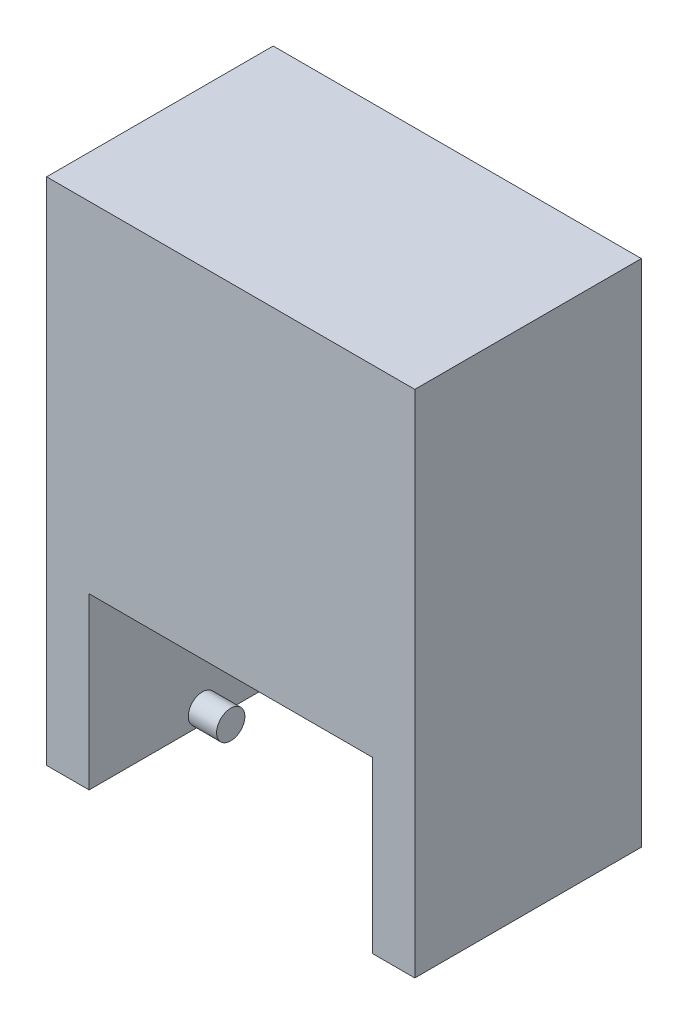
ISO-10303-21;
HEADER;
FILE_DESCRIPTION(('STEP AP214'),'2;1');
FILE_NAME('part.step','',(''),(''),'','','');
FILE_SCHEMA(('AUTOMOTIVE_DESIGN { 1 0 10303 214 1 1 1 1 }'));
ENDSEC;
DATA;
#1=APPLICATION_CONTEXT('core data for automotive mechanical design processes');
#2=APPLICATION_PROTOCOL_DEFINITION('international standard','automotive_design',2000,#1);
#3=PRODUCT_CONTEXT('',#1,'mechanical');
#4=PRODUCT('Part','Part','',(#3));
#5=PRODUCT_RELATED_PRODUCT_CATEGORY('part','',(#4));
#6=PRODUCT_DEFINITION_FORMATION('','',#4);
#7=PRODUCT_DEFINITION_CONTEXT('part definition',#1,'design');
#8=PRODUCT_DEFINITION('design','',#6,#7);
#9=PRODUCT_DEFINITION_SHAPE('','',#8);
#10=(LENGTH_UNIT() NAMED_UNIT(*) SI_UNIT(.MILLI.,.METRE.));
#11=(NAMED_UNIT(*) PLANE_ANGLE_UNIT() SI_UNIT($,.RADIAN.));
#12=(NAMED_UNIT(*) SI_UNIT($,.STERADIAN.) SOLID_ANGLE_UNIT());
#13=UNCERTAINTY_MEASURE_WITH_UNIT(LENGTH_MEASURE(1.E-05),#10,'distance_accuracy_value','');
#14=(GEOMETRIC_REPRESENTATION_CONTEXT(3) GLOBAL_UNCERTAINTY_ASSIGNED_CONTEXT((#13)) GLOBAL_UNIT_ASSIGNED_CONTEXT((#10,
#11,#12)) REPRESENTATION_CONTEXT('',''));
#15=CARTESIAN_POINT('',(0.,0.,0.));
#16=DIRECTION('',(0.,0.,1.));
#17=DIRECTION('',(1.,0.,0.));
#18=AXIS2_PLACEMENT_3D('',#15,#16,#17);
#19=CARTESIAN_POINT('',(0.,0.,203.2));
#20=DIRECTION('',(0.,1.,0.));
#21=DIRECTION('',(0.,0.,1.));
#22=AXIS2_PLACEMENT_3D('',#19,#20,#21);
#23=PLANE('',#22);
#24=DIRECTION('',(0.,0.,-1.));
#25=VECTOR('',#24,1.);
#26=CARTESIAN_POINT('',(38.0999999999999,0.,318.516));
#27=LINE('',#26,#25);
#28=CARTESIAN_POINT('',(38.0999999999999,0.,203.2));
#29=VERTEX_POINT('',#28);
#30=CARTESIAN_POINT('',(38.1000000000001,0.,101.6));
#31=VERTEX_POINT('',#30);
#32=EDGE_CURVE('E104',#29,#31,#27,.T.);
#33=ORIENTED_EDGE('',*,*,#32,.F.);
#34=DIRECTION('',(1.,0.,0.));
#35=VECTOR('',#34,1.);
#36=CARTESIAN_POINT('',(0.,0.,203.2));
#37=LINE('',#36,#35);
#38=CARTESIAN_POINT('',(0.,0.,203.2));
#39=VERTEX_POINT('',#38);
#40=EDGE_CURVE('E135',#39,#29,#37,.T.);
#41=ORIENTED_EDGE('',*,*,#40,.F.);
#42=DIRECTION('',(0.,0.,-1.));
#43=VECTOR('',#42,1.);
#44=CARTESIAN_POINT('',(0.,0.,203.2));
#45=LINE('',#44,#43);
#46=CARTESIAN_POINT('',(0.,0.,0.));
#47=VERTEX_POINT('',#46);
#48=EDGE_CURVE('E157',#39,#47,#45,.T.);
#49=ORIENTED_EDGE('',*,*,#48,.T.);
#50=DIRECTION('',(1.,0.,0.));
#51=VECTOR('',#50,1.);
#52=CARTESIAN_POINT('',(0.,0.,0.));
#53=LINE('',#52,#51);
#54=CARTESIAN_POINT('',(38.0999999999999,0.,1.11022302462516E-13));
#55=VERTEX_POINT('',#54);
#56=EDGE_CURVE('E118',#47,#55,#53,.T.);
#57=ORIENTED_EDGE('',*,*,#56,.T.);
#58=EDGE_CURVE('E114',#31,#55,#27,.T.);
#59=ORIENTED_EDGE('',*,*,#58,.F.);
#60=EDGE_LOOP('',(#33,#41,#49,#57,#59));
#61=FACE_BOUND('',#60,.T.);
#62=ADVANCED_FACE('F34',(#61),#23,.F.);
#63=DIRECTION('',(0.,0.,-1.));
#64=VECTOR('',#63,1.);
#65=CARTESIAN_POINT('',(292.1,0.,318.516));
#66=LINE('',#65,#64);
#67=CARTESIAN_POINT('',(292.1,0.,203.2));
#68=VERTEX_POINT('',#67);
#69=CARTESIAN_POINT('',(292.1,0.,101.6));
#70=VERTEX_POINT('',#69);
#71=EDGE_CURVE('E119',#68,#70,#66,.T.);
#72=ORIENTED_EDGE('',*,*,#71,.T.);
#73=CARTESIAN_POINT('',(292.1,0.,1.11022302462516E-13));
#74=VERTEX_POINT('',#73);
#75=EDGE_CURVE('E121',#70,#74,#66,.T.);
#76=ORIENTED_EDGE('',*,*,#75,.T.);
#77=CARTESIAN_POINT('',(330.2,0.,0.));
#78=VERTEX_POINT('',#77);
#79=EDGE_CURVE('E144',#74,#78,#53,.T.);
#80=ORIENTED_EDGE('',*,*,#79,.T.);
#81=DIRECTION('',(0.,0.,-1.));
#82=VECTOR('',#81,1.);
#83=CARTESIAN_POINT('',(330.2,0.,203.2));
#84=LINE('',#83,#82);
#85=CARTESIAN_POINT('',(330.2,0.,203.2));
#86=VERTEX_POINT('',#85);
#87=EDGE_CURVE('E154',#86,#78,#84,.T.);
#88=ORIENTED_EDGE('',*,*,#87,.F.);
#89=EDGE_CURVE('E133',#68,#86,#37,.T.);
#90=ORIENTED_EDGE('',*,*,#89,.F.);
#91=EDGE_LOOP('',(#72,#76,#80,#88,#90));
#92=FACE_BOUND('',#91,.T.);
#93=ADVANCED_FACE('F198',(#92),#23,.F.);
#94=CARTESIAN_POINT('',(0.,0.,203.2));
#95=DIRECTION('',(0.,0.,-1.));
#96=DIRECTION('',(-1.,0.,0.));
#97=AXIS2_PLACEMENT_3D('',#94,#95,#96);
#98=PLANE('',#97);
#99=DIRECTION('',(0.,-1.,0.));
#100=VECTOR('',#99,1.);
#101=CARTESIAN_POINT('',(38.0999999999999,0.,203.2));
#102=LINE('',#101,#100);
#103=CARTESIAN_POINT('',(38.0999999999999,152.4,203.2));
#104=VERTEX_POINT('',#103);
#105=EDGE_CURVE('E110',#104,#29,#102,.T.);
#106=ORIENTED_EDGE('',*,*,#105,.F.);
#107=DIRECTION('',(-1.,0.,0.));
#108=VECTOR('',#107,1.);
#109=CARTESIAN_POINT('',(0.,152.4,203.2));
#110=LINE('',#109,#108);
#111=CARTESIAN_POINT('',(292.1,152.4,203.2));
#112=VERTEX_POINT('',#111);
#113=EDGE_CURVE('E113',#112,#104,#110,.T.);
#114=ORIENTED_EDGE('',*,*,#113,.F.);
#115=DIRECTION('',(0.,1.,0.));
#116=VECTOR('',#115,1.);
#117=CARTESIAN_POINT('',(292.1,1.06396373193244E-13,203.2));
#118=LINE('',#117,#116);
#119=EDGE_CURVE('E126',#68,#112,#118,.T.);
#120=ORIENTED_EDGE('',*,*,#119,.F.);
#121=ORIENTED_EDGE('',*,*,#89,.T.);
#122=DIRECTION('',(0.,1.,0.));
#123=VECTOR('',#122,1.);
#124=CARTESIAN_POINT('',(330.2,0.,203.2));
#125=LINE('',#124,#123);
#126=CARTESIAN_POINT('',(330.2,457.2,203.2));
#127=VERTEX_POINT('',#126);
#128=EDGE_CURVE('E137',#86,#127,#125,.T.);
#129=ORIENTED_EDGE('',*,*,#128,.T.);
#130=DIRECTION('',(-1.,0.,0.));
#131=VECTOR('',#130,1.);
#132=CARTESIAN_POINT('',(-1.11022302462516E-13,457.2,203.2));
#133=LINE('',#132,#131);
#134=CARTESIAN_POINT('',(-1.11022302462516E-13,457.2,203.2));
#135=VERTEX_POINT('',#134);
#136=EDGE_CURVE('E139',#127,#135,#133,.T.);
#137=ORIENTED_EDGE('',*,*,#136,.T.);
#138=DIRECTION('',(0.,-1.,0.));
#139=VECTOR('',#138,1.);
#140=CARTESIAN_POINT('',(0.,0.,203.2));
#141=LINE('',#140,#139);
#142=EDGE_CURVE('E130',#135,#39,#141,.T.);
#143=ORIENTED_EDGE('',*,*,#142,.T.);
#144=ORIENTED_EDGE('',*,*,#40,.T.);
#145=EDGE_LOOP('',(#106,#114,#120,#121,#129,#137,#143,#144));
#146=FACE_BOUND('',#145,.T.);
#147=ADVANCED_FACE('F202',(#146),#98,.F.);
#148=CARTESIAN_POINT('',(0.,0.,0.));
#149=DIRECTION('',(0.,0.,-1.));
#150=DIRECTION('',(-1.,0.,0.));
#151=AXIS2_PLACEMENT_3D('',#148,#149,#150);
#152=PLANE('',#151);
#153=DIRECTION('',(-1.,0.,0.));
#154=VECTOR('',#153,1.);
#155=CARTESIAN_POINT('',(0.,152.4,0.));
#156=LINE('',#155,#154);
#157=CARTESIAN_POINT('',(292.1,152.4,1.11022302462516E-13));
#158=VERTEX_POINT('',#157);
#159=CARTESIAN_POINT('',(38.0999999999999,152.4,0.));
#160=VERTEX_POINT('',#159);
#161=EDGE_CURVE('E159',#158,#160,#156,.T.);
#162=ORIENTED_EDGE('',*,*,#161,.T.);
#163=DIRECTION('',(0.,-1.,0.));
#164=VECTOR('',#163,1.);
#165=CARTESIAN_POINT('',(38.0999999999999,0.,0.));
#166=LINE('',#165,#164);
#167=EDGE_CURVE('E11',#160,#55,#166,.T.);
#168=ORIENTED_EDGE('',*,*,#167,.T.);
#169=ORIENTED_EDGE('',*,*,#56,.F.);
#170=DIRECTION('',(0.,-1.,0.));
#171=VECTOR('',#170,1.);
#172=CARTESIAN_POINT('',(0.,0.,0.));
#173=LINE('',#172,#171);
#174=CARTESIAN_POINT('',(-1.11022302462516E-13,457.2,0.));
#175=VERTEX_POINT('',#174);
#176=EDGE_CURVE('E129',#175,#47,#173,.T.);
#177=ORIENTED_EDGE('',*,*,#176,.F.);
#178=DIRECTION('',(-1.,0.,0.));
#179=VECTOR('',#178,1.);
#180=CARTESIAN_POINT('',(-1.11022302462516E-13,457.2,0.));
#181=LINE('',#180,#179);
#182=CARTESIAN_POINT('',(330.2,457.2,0.));
#183=VERTEX_POINT('',#182);
#184=EDGE_CURVE('E134',#183,#175,#181,.T.);
#185=ORIENTED_EDGE('',*,*,#184,.F.);
#186=DIRECTION('',(0.,1.,0.));
#187=VECTOR('',#186,1.);
#188=CARTESIAN_POINT('',(330.2,0.,0.));
#189=LINE('',#188,#187);
#190=EDGE_CURVE('E146',#78,#183,#189,.T.);
#191=ORIENTED_EDGE('',*,*,#190,.F.);
#192=ORIENTED_EDGE('',*,*,#79,.F.);
#193=DIRECTION('',(0.,1.,0.));
#194=VECTOR('',#193,1.);
#195=CARTESIAN_POINT('',(292.1,1.06396373193244E-13,0.));
#196=LINE('',#195,#194);
#197=EDGE_CURVE('E42',#74,#158,#196,.T.);
#198=ORIENTED_EDGE('',*,*,#197,.T.);
#199=EDGE_LOOP('',(#162,#168,#169,#177,#185,#191,#192,#198));
#200=FACE_BOUND('',#199,.T.);
#201=ADVANCED_FACE('F165',(#200),#152,.T.);
#202=CARTESIAN_POINT('',(0.,0.,203.2));
#203=DIRECTION('',(1.,0.,0.));
#204=DIRECTION('',(0.,1.,0.));
#205=AXIS2_PLACEMENT_3D('',#202,#203,#204);
#206=PLANE('',#205);
#207=ORIENTED_EDGE('',*,*,#176,.T.);
#208=ORIENTED_EDGE('',*,*,#48,.F.);
#209=ORIENTED_EDGE('',*,*,#142,.F.);
#210=DIRECTION('',(0.,0.,-1.));
#211=VECTOR('',#210,1.);
#212=CARTESIAN_POINT('',(-1.11022302462516E-13,457.2,203.2));
#213=LINE('',#212,#211);
#214=EDGE_CURVE('E141',#135,#175,#213,.T.);
#215=ORIENTED_EDGE('',*,*,#214,.T.);
#216=EDGE_LOOP('',(#207,#208,#209,#215));
#217=FACE_BOUND('',#216,.T.);
#218=ADVANCED_FACE('F36',(#217),#206,.F.);
#219=CARTESIAN_POINT('',(330.2,0.,203.2));
#220=DIRECTION('',(-1.,0.,0.));
#221=DIRECTION('',(0.,-1.,0.));
#222=AXIS2_PLACEMENT_3D('',#219,#220,#221);
#223=PLANE('',#222);
#224=ORIENTED_EDGE('',*,*,#190,.T.);
#225=DIRECTION('',(0.,0.,-1.));
#226=VECTOR('',#225,1.);
#227=CARTESIAN_POINT('',(330.2,457.2,203.2));
#228=LINE('',#227,#226);
#229=EDGE_CURVE('E151',#127,#183,#228,.T.);
#230=ORIENTED_EDGE('',*,*,#229,.F.);
#231=ORIENTED_EDGE('',*,*,#128,.F.);
#232=ORIENTED_EDGE('',*,*,#87,.T.);
#233=EDGE_LOOP('',(#224,#230,#231,#232));
#234=FACE_BOUND('',#233,.T.);
#235=ADVANCED_FACE('F205',(#234),#223,.F.);
#236=CARTESIAN_POINT('',(-1.11022302462516E-13,457.2,203.2));
#237=DIRECTION('',(0.,-1.,0.));
#238=DIRECTION('',(0.,0.,-1.));
#239=AXIS2_PLACEMENT_3D('',#236,#237,#238);
#240=PLANE('',#239);
#241=ORIENTED_EDGE('',*,*,#184,.T.);
#242=ORIENTED_EDGE('',*,*,#214,.F.);
#243=ORIENTED_EDGE('',*,*,#136,.F.);
#244=ORIENTED_EDGE('',*,*,#229,.T.);
#245=EDGE_LOOP('',(#241,#242,#243,#244));
#246=FACE_BOUND('',#245,.T.);
#247=ADVANCED_FACE('F208',(#246),#240,.F.);
#248=CARTESIAN_POINT('',(38.0999999999999,0.,318.516));
#249=DIRECTION('',(1.,0.,0.));
#250=DIRECTION('',(0.,0.,-1.));
#251=AXIS2_PLACEMENT_3D('',#248,#249,#250);
#252=PLANE('',#251);
#253=ORIENTED_EDGE('',*,*,#32,.T.);
#254=CARTESIAN_POINT('',(38.1000000000001,12.7,101.6));
#255=DIRECTION('',(-1.,0.,0.));
#256=DIRECTION('',(0.,-1.,0.));
#257=AXIS2_PLACEMENT_3D('',#254,#255,#256);
#258=CIRCLE('',#257,12.7);
#259=EDGE_CURVE('E108',#31,#31,#258,.T.);
#260=ORIENTED_EDGE('',*,*,#259,.T.);
#261=ORIENTED_EDGE('',*,*,#58,.T.);
#262=ORIENTED_EDGE('',*,*,#167,.F.);
#263=DIRECTION('',(0.,0.,-1.));
#264=VECTOR('',#263,1.);
#265=CARTESIAN_POINT('',(38.0999999999999,152.4,318.516));
#266=LINE('',#265,#264);
#267=EDGE_CURVE('E54',#104,#160,#266,.T.);
#268=ORIENTED_EDGE('',*,*,#267,.F.);
#269=ORIENTED_EDGE('',*,*,#105,.T.);
#270=EDGE_LOOP('',(#253,#260,#261,#262,#268,#269));
#271=FACE_BOUND('',#270,.T.);
#272=ADVANCED_FACE('F106',(#271),#252,.T.);
#273=CARTESIAN_POINT('',(292.1,0.,318.516));
#274=DIRECTION('',(-1.,0.,0.));
#275=DIRECTION('',(0.,-1.,0.));
#276=AXIS2_PLACEMENT_3D('',#273,#274,#275);
#277=PLANE('',#276);
#278=ORIENTED_EDGE('',*,*,#75,.F.);
#279=CARTESIAN_POINT('',(292.1,12.7000000000001,101.6));
#280=DIRECTION('',(-1.,0.,0.));
#281=DIRECTION('',(0.,-1.,0.));
#282=AXIS2_PLACEMENT_3D('',#279,#280,#281);
#283=CIRCLE('',#282,12.7);
#284=EDGE_CURVE('E47',#70,#70,#283,.T.);
#285=ORIENTED_EDGE('',*,*,#284,.F.);
#286=ORIENTED_EDGE('',*,*,#71,.F.);
#287=ORIENTED_EDGE('',*,*,#119,.T.);
#288=DIRECTION('',(0.,0.,-1.));
#289=VECTOR('',#288,1.);
#290=CARTESIAN_POINT('',(292.1,152.4,318.516));
#291=LINE('',#290,#289);
#292=EDGE_CURVE('E172',#112,#158,#291,.T.);
#293=ORIENTED_EDGE('',*,*,#292,.T.);
#294=ORIENTED_EDGE('',*,*,#197,.F.);
#295=EDGE_LOOP('',(#278,#285,#286,#287,#293,#294));
#296=FACE_BOUND('',#295,.T.);
#297=ADVANCED_FACE('F170',(#296),#277,.T.);
#298=CARTESIAN_POINT('',(38.0999999999999,152.4,318.516));
#299=DIRECTION('',(0.,-1.,0.));
#300=DIRECTION('',(1.,0.,0.));
#301=AXIS2_PLACEMENT_3D('',#298,#299,#300);
#302=PLANE('',#301);
#303=ORIENTED_EDGE('',*,*,#113,.T.);
#304=ORIENTED_EDGE('',*,*,#267,.T.);
#305=ORIENTED_EDGE('',*,*,#161,.F.);
#306=ORIENTED_EDGE('',*,*,#292,.F.);
#307=EDGE_LOOP('',(#303,#304,#305,#306));
#308=FACE_BOUND('',#307,.T.);
#309=ADVANCED_FACE('F222',(#308),#302,.T.);
#310=CARTESIAN_POINT('',(266.7,12.7000000000001,101.6));
#311=DIRECTION('',(1.,0.,0.));
#312=DIRECTION('',(0.,1.,0.));
#313=AXIS2_PLACEMENT_3D('',#310,#311,#312);
#314=CYLINDRICAL_SURFACE('',#313,12.7);
#315=CARTESIAN_POINT('',(266.7,12.7000000000001,101.6));
#316=DIRECTION('',(-1.,0.,0.));
#317=DIRECTION('',(0.,-1.,0.));
#318=AXIS2_PLACEMENT_3D('',#315,#316,#317);
#319=CIRCLE('',#318,12.7);
#320=CARTESIAN_POINT('',(266.7,0.,101.6));
#321=VERTEX_POINT('',#320);
#322=EDGE_CURVE('E175',#321,#321,#319,.T.);
#323=ORIENTED_EDGE('',*,*,#322,.F.);
#324=EDGE_LOOP('',(#323));
#325=FACE_BOUND('',#324,.T.);
#326=ORIENTED_EDGE('',*,*,#284,.T.);
#327=EDGE_LOOP('',(#326));
#328=FACE_BOUND('',#327,.T.);
#329=ADVANCED_FACE('F225',(#325,#328),#314,.T.);
#330=CARTESIAN_POINT('',(266.7,12.7000000000001,101.6));
#331=DIRECTION('',(-1.,0.,0.));
#332=DIRECTION('',(0.,-1.,0.));
#333=AXIS2_PLACEMENT_3D('',#330,#331,#332);
#334=PLANE('',#333);
#335=ORIENTED_EDGE('',*,*,#322,.T.);
#336=EDGE_LOOP('',(#335));
#337=FACE_BOUND('',#336,.T.);
#338=ADVANCED_FACE('F195',(#337),#334,.T.);
#339=CARTESIAN_POINT('',(63.5000000000001,12.7,101.6));
#340=DIRECTION('',(-1.,0.,0.));
#341=DIRECTION('',(0.,-1.,0.));
#342=AXIS2_PLACEMENT_3D('',#339,#340,#341);
#343=CYLINDRICAL_SURFACE('',#342,12.7);
#344=CARTESIAN_POINT('',(63.5000000000001,12.7,101.6));
#345=DIRECTION('',(-1.,0.,0.));
#346=DIRECTION('',(0.,-1.,0.));
#347=AXIS2_PLACEMENT_3D('',#344,#345,#346);
#348=CIRCLE('',#347,12.7);
#349=CARTESIAN_POINT('',(63.5000000000001,0.,101.6));
#350=VERTEX_POINT('',#349);
#351=EDGE_CURVE('E179',#350,#350,#348,.T.);
#352=ORIENTED_EDGE('',*,*,#351,.T.);
#353=EDGE_LOOP('',(#352));
#354=FACE_BOUND('',#353,.T.);
#355=ORIENTED_EDGE('',*,*,#259,.F.);
#356=EDGE_LOOP('',(#355));
#357=FACE_BOUND('',#356,.T.);
#358=ADVANCED_FACE('F186',(#354,#357),#343,.T.);
#359=CARTESIAN_POINT('',(63.5000000000001,12.7,101.6));
#360=DIRECTION('',(1.,0.,0.));
#361=DIRECTION('',(0.,-1.,0.));
#362=AXIS2_PLACEMENT_3D('',#359,#360,#361);
#363=PLANE('',#362);
#364=ORIENTED_EDGE('',*,*,#351,.F.);
#365=EDGE_LOOP('',(#364));
#366=FACE_BOUND('',#365,.T.);
#367=ADVANCED_FACE('F189',(#366),#363,.T.);
#368=CLOSED_SHELL('',(#62,#93,#147,#201,#218,#235,#247,#272,#297,#309,#329,#338,#358,#367));
#369=MANIFOLD_SOLID_BREP('B2',#368);
#370=ADVANCED_BREP_SHAPE_REPRESENTATION('',(#18,#369),#14);
#371=SHAPE_DEFINITION_REPRESENTATION(#9,#370);
ENDSEC;
END-ISO-10303-21;
